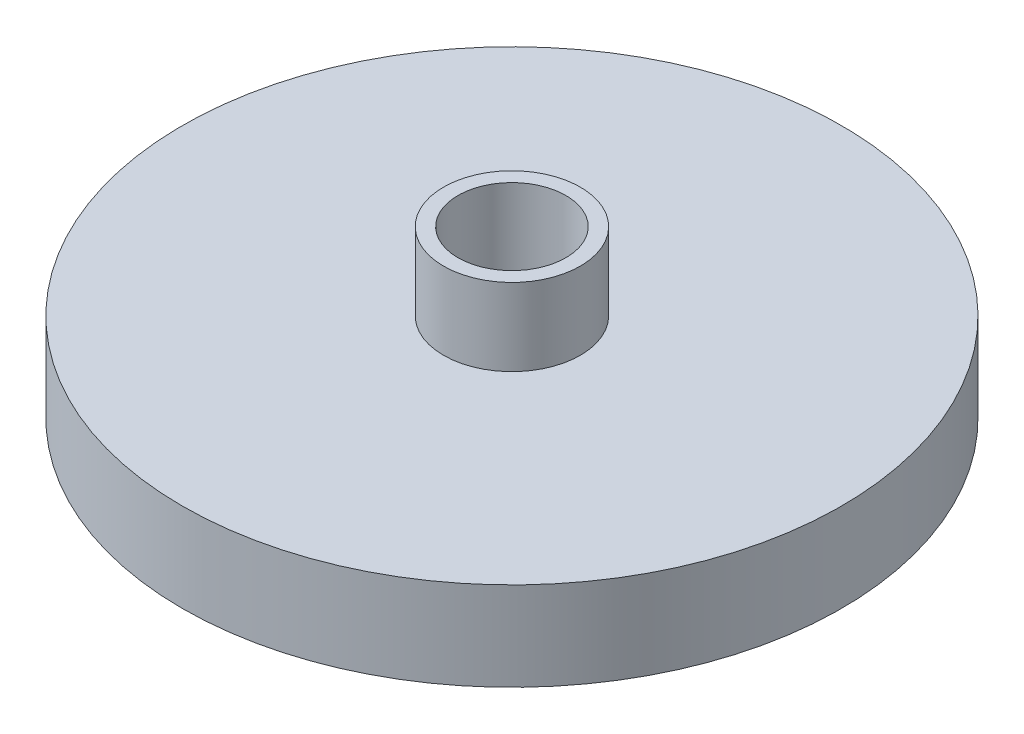
ISO-10303-21;
HEADER;
FILE_DESCRIPTION(('STEP AP214'),'2;1');
FILE_NAME('part.step','',(''),(''),'','','');
FILE_SCHEMA(('AUTOMOTIVE_DESIGN { 1 0 10303 214 1 1 1 1 }'));
ENDSEC;
DATA;
#1=APPLICATION_CONTEXT('core data for automotive mechanical design processes');
#2=APPLICATION_PROTOCOL_DEFINITION('international standard','automotive_design',2000,#1);
#3=PRODUCT_CONTEXT('',#1,'mechanical');
#4=PRODUCT('Part','Part','',(#3));
#5=PRODUCT_RELATED_PRODUCT_CATEGORY('part','',(#4));
#6=PRODUCT_DEFINITION_FORMATION('','',#4);
#7=PRODUCT_DEFINITION_CONTEXT('part definition',#1,'design');
#8=PRODUCT_DEFINITION('design','',#6,#7);
#9=PRODUCT_DEFINITION_SHAPE('','',#8);
#10=(LENGTH_UNIT() NAMED_UNIT(*) SI_UNIT(.MILLI.,.METRE.));
#11=(NAMED_UNIT(*) PLANE_ANGLE_UNIT() SI_UNIT($,.RADIAN.));
#12=(NAMED_UNIT(*) SI_UNIT($,.STERADIAN.) SOLID_ANGLE_UNIT());
#13=UNCERTAINTY_MEASURE_WITH_UNIT(LENGTH_MEASURE(1.E-05),#10,'distance_accuracy_value','');
#14=(GEOMETRIC_REPRESENTATION_CONTEXT(3) GLOBAL_UNCERTAINTY_ASSIGNED_CONTEXT((#13)) GLOBAL_UNIT_ASSIGNED_CONTEXT((#10,
#11,#12)) REPRESENTATION_CONTEXT('',''));
#15=CARTESIAN_POINT('',(0.,0.,0.));
#16=DIRECTION('',(0.,0.,1.));
#17=DIRECTION('',(1.,0.,0.));
#18=AXIS2_PLACEMENT_3D('',#15,#16,#17);
#19=CARTESIAN_POINT('',(0.,5.22,0.));
#20=DIRECTION('',(0.,1.,0.));
#21=DIRECTION('',(0.,0.,1.));
#22=AXIS2_PLACEMENT_3D('',#19,#20,#21);
#23=PLANE('',#22);
#24=CARTESIAN_POINT('',(0.,5.22,0.));
#25=DIRECTION('',(0.,1.,0.));
#26=DIRECTION('',(0.,0.,1.));
#27=AXIS2_PLACEMENT_3D('',#24,#25,#26);
#28=CIRCLE('',#27,19.3929);
#29=CARTESIAN_POINT('',(0.,5.22,19.3929));
#30=VERTEX_POINT('',#29);
#31=EDGE_CURVE('E10',#30,#30,#28,.T.);
#32=ORIENTED_EDGE('',*,*,#31,.T.);
#33=EDGE_LOOP('',(#32));
#34=FACE_BOUND('',#33,.T.);
#35=CARTESIAN_POINT('',(0.,5.22,0.));
#36=DIRECTION('',(0.,1.,0.));
#37=DIRECTION('',(0.,0.,1.));
#38=AXIS2_PLACEMENT_3D('',#35,#36,#37);
#39=CIRCLE('',#38,4.0259);
#40=CARTESIAN_POINT('',(0.,5.22,4.0259));
#41=VERTEX_POINT('',#40);
#42=EDGE_CURVE('E56',#41,#41,#39,.T.);
#43=ORIENTED_EDGE('',*,*,#42,.F.);
#44=EDGE_LOOP('',(#43));
#45=FACE_BOUND('',#44,.T.);
#46=ADVANCED_FACE('F37',(#34,#45),#23,.T.);
#47=CARTESIAN_POINT('',(0.,5.22,0.));
#48=DIRECTION('',(0.,-1.,0.));
#49=DIRECTION('',(0.,0.,-1.));
#50=AXIS2_PLACEMENT_3D('',#47,#48,#49);
#51=CYLINDRICAL_SURFACE('',#50,19.3929);
#52=ORIENTED_EDGE('',*,*,#31,.F.);
#53=EDGE_LOOP('',(#52));
#54=FACE_BOUND('',#53,.T.);
#55=CARTESIAN_POINT('',(0.,0.,0.));
#56=DIRECTION('',(0.,1.,0.));
#57=DIRECTION('',(0.,0.,1.));
#58=AXIS2_PLACEMENT_3D('',#55,#56,#57);
#59=CIRCLE('',#58,19.3929);
#60=CARTESIAN_POINT('',(0.,0.,19.3929));
#61=VERTEX_POINT('',#60);
#62=EDGE_CURVE('E41',#61,#61,#59,.T.);
#63=ORIENTED_EDGE('',*,*,#62,.T.);
#64=EDGE_LOOP('',(#63));
#65=FACE_BOUND('',#64,.T.);
#66=ADVANCED_FACE('F39',(#54,#65),#51,.T.);
#67=CARTESIAN_POINT('',(0.,0.,0.));
#68=DIRECTION('',(0.,1.,0.));
#69=DIRECTION('',(0.,0.,1.));
#70=AXIS2_PLACEMENT_3D('',#67,#68,#69);
#71=PLANE('',#70);
#72=CARTESIAN_POINT('',(0.,0.,0.));
#73=DIRECTION('',(0.,1.,0.));
#74=DIRECTION('',(0.,0.,1.));
#75=AXIS2_PLACEMENT_3D('',#72,#73,#74);
#76=CIRCLE('',#75,3.175);
#77=CARTESIAN_POINT('',(0.,0.,3.175));
#78=VERTEX_POINT('',#77);
#79=EDGE_CURVE('E50',#78,#78,#76,.T.);
#80=ORIENTED_EDGE('',*,*,#79,.T.);
#81=EDGE_LOOP('',(#80));
#82=FACE_BOUND('',#81,.T.);
#83=ORIENTED_EDGE('',*,*,#62,.F.);
#84=EDGE_LOOP('',(#83));
#85=FACE_BOUND('',#84,.T.);
#86=ADVANCED_FACE('F81',(#82,#85),#71,.F.);
#87=CARTESIAN_POINT('',(0.,0.,0.));
#88=DIRECTION('',(0.,1.,0.));
#89=DIRECTION('',(0.,0.,1.));
#90=AXIS2_PLACEMENT_3D('',#87,#88,#89);
#91=CYLINDRICAL_SURFACE('',#90,3.175);
#92=ORIENTED_EDGE('',*,*,#79,.F.);
#93=EDGE_LOOP('',(#92));
#94=FACE_BOUND('',#93,.T.);
#95=CARTESIAN_POINT('',(0.,9.7666,0.));
#96=DIRECTION('',(0.,1.,0.));
#97=DIRECTION('',(0.,0.,1.));
#98=AXIS2_PLACEMENT_3D('',#95,#96,#97);
#99=CIRCLE('',#98,3.175);
#100=CARTESIAN_POINT('',(0.,9.7666,3.175));
#101=VERTEX_POINT('',#100);
#102=EDGE_CURVE('E60',#101,#101,#99,.T.);
#103=ORIENTED_EDGE('',*,*,#102,.T.);
#104=EDGE_LOOP('',(#103));
#105=FACE_BOUND('',#104,.T.);
#106=ADVANCED_FACE('F68',(#94,#105),#91,.F.);
#107=CARTESIAN_POINT('',(0.,9.7666,0.));
#108=DIRECTION('',(0.,1.,0.));
#109=DIRECTION('',(0.,0.,1.));
#110=AXIS2_PLACEMENT_3D('',#107,#108,#109);
#111=PLANE('',#110);
#112=CARTESIAN_POINT('',(0.,9.7666,0.));
#113=DIRECTION('',(0.,1.,0.));
#114=DIRECTION('',(0.,0.,1.));
#115=AXIS2_PLACEMENT_3D('',#112,#113,#114);
#116=CIRCLE('',#115,4.0259);
#117=CARTESIAN_POINT('',(0.,9.7666,4.0259));
#118=VERTEX_POINT('',#117);
#119=EDGE_CURVE('E55',#118,#118,#116,.T.);
#120=ORIENTED_EDGE('',*,*,#119,.T.);
#121=EDGE_LOOP('',(#120));
#122=FACE_BOUND('',#121,.T.);
#123=ORIENTED_EDGE('',*,*,#102,.F.);
#124=EDGE_LOOP('',(#123));
#125=FACE_BOUND('',#124,.T.);
#126=ADVANCED_FACE('F70',(#122,#125),#111,.T.);
#127=CARTESIAN_POINT('',(0.,9.7666,0.));
#128=DIRECTION('',(0.,-1.,0.));
#129=DIRECTION('',(0.,0.,-1.));
#130=AXIS2_PLACEMENT_3D('',#127,#128,#129);
#131=CYLINDRICAL_SURFACE('',#130,4.0259);
#132=ORIENTED_EDGE('',*,*,#119,.F.);
#133=EDGE_LOOP('',(#132));
#134=FACE_BOUND('',#133,.T.);
#135=ORIENTED_EDGE('',*,*,#42,.T.);
#136=EDGE_LOOP('',(#135));
#137=FACE_BOUND('',#136,.T.);
#138=ADVANCED_FACE('F72',(#134,#137),#131,.T.);
#139=CLOSED_SHELL('',(#46,#66,#86,#106,#126,#138));
#140=MANIFOLD_SOLID_BREP('B2',#139);
#141=ADVANCED_BREP_SHAPE_REPRESENTATION('',(#18,#140),#14);
#142=SHAPE_DEFINITION_REPRESENTATION(#9,#141);
ENDSEC;
END-ISO-10303-21;
